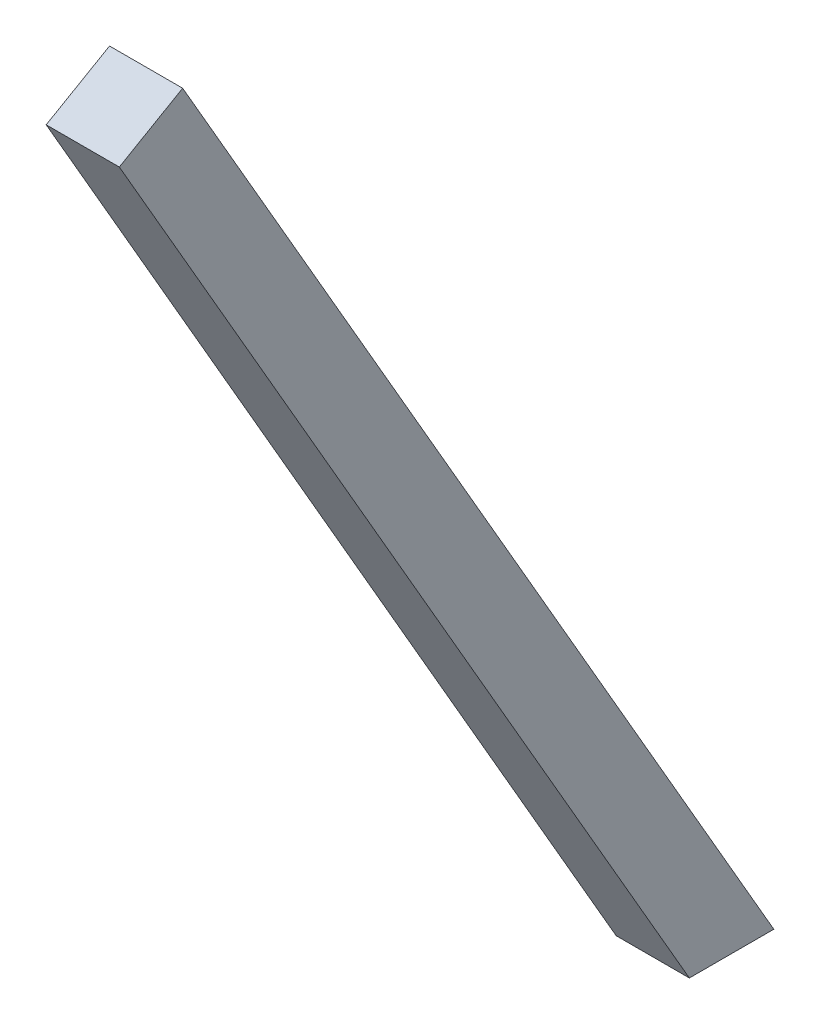
ISO-10303-21;
HEADER;
FILE_DESCRIPTION(('STEP AP214'),'2;1');
FILE_NAME('part.step','',(''),(''),'','','');
FILE_SCHEMA(('AUTOMOTIVE_DESIGN { 1 0 10303 214 1 1 1 1 }'));
ENDSEC;
DATA;
#1=APPLICATION_CONTEXT('core data for automotive mechanical design processes');
#2=APPLICATION_PROTOCOL_DEFINITION('international standard','automotive_design',2000,#1);
#3=PRODUCT_CONTEXT('',#1,'mechanical');
#4=PRODUCT('Part','Part','',(#3));
#5=PRODUCT_RELATED_PRODUCT_CATEGORY('part','',(#4));
#6=PRODUCT_DEFINITION_FORMATION('','',#4);
#7=PRODUCT_DEFINITION_CONTEXT('part definition',#1,'design');
#8=PRODUCT_DEFINITION('design','',#6,#7);
#9=PRODUCT_DEFINITION_SHAPE('','',#8);
#10=(LENGTH_UNIT() NAMED_UNIT(*) SI_UNIT(.MILLI.,.METRE.));
#11=(NAMED_UNIT(*) PLANE_ANGLE_UNIT() SI_UNIT($,.RADIAN.));
#12=(NAMED_UNIT(*) SI_UNIT($,.STERADIAN.) SOLID_ANGLE_UNIT());
#13=UNCERTAINTY_MEASURE_WITH_UNIT(LENGTH_MEASURE(1.E-05),#10,'distance_accuracy_value','');
#14=(GEOMETRIC_REPRESENTATION_CONTEXT(3) GLOBAL_UNCERTAINTY_ASSIGNED_CONTEXT((#13)) GLOBAL_UNIT_ASSIGNED_CONTEXT((#10,
#11,#12)) REPRESENTATION_CONTEXT('',''));
#15=CARTESIAN_POINT('',(0.,0.,0.));
#16=DIRECTION('',(0.,0.,1.));
#17=DIRECTION('',(1.,0.,0.));
#18=AXIS2_PLACEMENT_3D('',#15,#16,#17);
#19=CARTESIAN_POINT('',(25.4,0.,-29.329393674833));
#20=DIRECTION('',(0.,1.,0.));
#21=DIRECTION('',(0.,0.,1.));
#22=AXIS2_PLACEMENT_3D('',#19,#20,#21);
#23=PLANE('',#22);
#24=DIRECTION('',(0.,0.,-1.));
#25=VECTOR('',#24,1.);
#26=CARTESIAN_POINT('',(0.,0.,-29.329393674833));
#27=LINE('',#26,#25);
#28=CARTESIAN_POINT('',(0.,0.,0.));
#29=VERTEX_POINT('',#28);
#30=CARTESIAN_POINT('',(0.,0.,-29.329393674833));
#31=VERTEX_POINT('',#30);
#32=EDGE_CURVE('E96',#29,#31,#27,.T.);
#33=ORIENTED_EDGE('',*,*,#32,.T.);
#34=DIRECTION('',(-1.,0.,0.));
#35=VECTOR('',#34,1.);
#36=CARTESIAN_POINT('',(25.4,0.,-29.329393674833));
#37=LINE('',#36,#35);
#38=CARTESIAN_POINT('',(25.4,0.,-29.329393674833));
#39=VERTEX_POINT('',#38);
#40=EDGE_CURVE('E11',#39,#31,#37,.T.);
#41=ORIENTED_EDGE('',*,*,#40,.F.);
#42=DIRECTION('',(0.,0.,-1.));
#43=VECTOR('',#42,1.);
#44=CARTESIAN_POINT('',(25.4,0.,-29.329393674833));
#45=LINE('',#44,#43);
#46=CARTESIAN_POINT('',(25.4,0.,0.));
#47=VERTEX_POINT('',#46);
#48=EDGE_CURVE('E84',#47,#39,#45,.T.);
#49=ORIENTED_EDGE('',*,*,#48,.F.);
#50=DIRECTION('',(-1.,0.,0.));
#51=VECTOR('',#50,1.);
#52=CARTESIAN_POINT('',(25.4,0.,0.));
#53=LINE('',#52,#51);
#54=EDGE_CURVE('E92',#47,#29,#53,.T.);
#55=ORIENTED_EDGE('',*,*,#54,.T.);
#56=EDGE_LOOP('',(#33,#41,#49,#55));
#57=FACE_BOUND('',#56,.T.);
#58=ADVANCED_FACE('F33',(#57),#23,.F.);
#59=CARTESIAN_POINT('',(25.4,355.6,175.976362048997));
#60=DIRECTION('',(0.,-0.499999999999998,0.86602540378444));
#61=DIRECTION('',(0.,-0.86602540378444,-0.499999999999998));
#62=AXIS2_PLACEMENT_3D('',#59,#60,#61);
#63=PLANE('',#62);
#64=DIRECTION('',(0.,0.86602540378444,0.499999999999998));
#65=VECTOR('',#64,1.);
#66=CARTESIAN_POINT('',(0.,355.6,175.976362048997));
#67=LINE('',#66,#65);
#68=CARTESIAN_POINT('',(0.,355.6,175.976362048997));
#69=VERTEX_POINT('',#68);
#70=EDGE_CURVE('E88',#31,#69,#67,.T.);
#71=ORIENTED_EDGE('',*,*,#70,.T.);
#72=DIRECTION('',(-1.,0.,0.));
#73=VECTOR('',#72,1.);
#74=CARTESIAN_POINT('',(25.4,355.6,175.976362048997));
#75=LINE('',#74,#73);
#76=CARTESIAN_POINT('',(25.4,355.6,175.976362048997));
#77=VERTEX_POINT('',#76);
#78=EDGE_CURVE('E41',#77,#69,#75,.T.);
#79=ORIENTED_EDGE('',*,*,#78,.F.);
#80=DIRECTION('',(0.,0.86602540378444,0.499999999999998));
#81=VECTOR('',#80,1.);
#82=CARTESIAN_POINT('',(25.4,355.6,175.976362048997));
#83=LINE('',#82,#81);
#84=EDGE_CURVE('E79',#39,#77,#83,.T.);
#85=ORIENTED_EDGE('',*,*,#84,.F.);
#86=ORIENTED_EDGE('',*,*,#40,.T.);
#87=EDGE_LOOP('',(#71,#79,#85,#86));
#88=FACE_BOUND('',#87,.T.);
#89=ADVANCED_FACE('F87',(#88),#63,.F.);
#90=CARTESIAN_POINT('',(25.4,342.9,197.973407305121));
#91=DIRECTION('',(0.,-0.86602540378444,-0.499999999999997));
#92=DIRECTION('',(0.,0.499999999999997,-0.866025403784441));
#93=AXIS2_PLACEMENT_3D('',#90,#91,#92);
#94=PLANE('',#93);
#95=DIRECTION('',(0.,-0.499999999999997,0.86602540378444));
#96=VECTOR('',#95,1.);
#97=CARTESIAN_POINT('',(0.,342.9,197.973407305121));
#98=LINE('',#97,#96);
#99=CARTESIAN_POINT('',(0.,342.9,197.973407305121));
#100=VERTEX_POINT('',#99);
#101=EDGE_CURVE('E66',#69,#100,#98,.T.);
#102=ORIENTED_EDGE('',*,*,#101,.T.);
#103=DIRECTION('',(-1.,0.,0.));
#104=VECTOR('',#103,1.);
#105=CARTESIAN_POINT('',(25.4,342.9,197.973407305121));
#106=LINE('',#105,#104);
#107=CARTESIAN_POINT('',(25.4,342.9,197.973407305121));
#108=VERTEX_POINT('',#107);
#109=EDGE_CURVE('E89',#108,#100,#106,.T.);
#110=ORIENTED_EDGE('',*,*,#109,.F.);
#111=DIRECTION('',(0.,-0.499999999999997,0.86602540378444));
#112=VECTOR('',#111,1.);
#113=CARTESIAN_POINT('',(25.4,342.9,197.973407305121));
#114=LINE('',#113,#112);
#115=EDGE_CURVE('E82',#77,#108,#114,.T.);
#116=ORIENTED_EDGE('',*,*,#115,.F.);
#117=ORIENTED_EDGE('',*,*,#78,.T.);
#118=EDGE_LOOP('',(#102,#110,#116,#117));
#119=FACE_BOUND('',#118,.T.);
#120=ADVANCED_FACE('F90',(#119),#94,.F.);
#121=CARTESIAN_POINT('',(25.4,0.,0.));
#122=DIRECTION('',(0.,0.499999999999998,-0.86602540378444));
#123=DIRECTION('',(0.,0.86602540378444,0.499999999999998));
#124=AXIS2_PLACEMENT_3D('',#121,#122,#123);
#125=PLANE('',#124);
#126=DIRECTION('',(0.,-0.86602540378444,-0.499999999999998));
#127=VECTOR('',#126,1.);
#128=CARTESIAN_POINT('',(0.,0.,0.));
#129=LINE('',#128,#127);
#130=EDGE_CURVE('E72',#100,#29,#129,.T.);
#131=ORIENTED_EDGE('',*,*,#130,.T.);
#132=ORIENTED_EDGE('',*,*,#54,.F.);
#133=DIRECTION('',(0.,-0.86602540378444,-0.499999999999998));
#134=VECTOR('',#133,1.);
#135=CARTESIAN_POINT('',(25.4,0.,0.));
#136=LINE('',#135,#134);
#137=EDGE_CURVE('E49',#108,#47,#136,.T.);
#138=ORIENTED_EDGE('',*,*,#137,.F.);
#139=ORIENTED_EDGE('',*,*,#109,.T.);
#140=EDGE_LOOP('',(#131,#132,#138,#139));
#141=FACE_BOUND('',#140,.T.);
#142=ADVANCED_FACE('F103',(#141),#125,.F.);
#143=CARTESIAN_POINT('',(25.4,0.,0.));
#144=DIRECTION('',(-1.,0.,0.));
#145=DIRECTION('',(0.,0.,1.));
#146=AXIS2_PLACEMENT_3D('',#143,#144,#145);
#147=PLANE('',#146);
#148=ORIENTED_EDGE('',*,*,#48,.T.);
#149=ORIENTED_EDGE('',*,*,#84,.T.);
#150=ORIENTED_EDGE('',*,*,#115,.T.);
#151=ORIENTED_EDGE('',*,*,#137,.T.);
#152=EDGE_LOOP('',(#148,#149,#150,#151));
#153=FACE_BOUND('',#152,.T.);
#154=ADVANCED_FACE('F80',(#153),#147,.F.);
#155=CARTESIAN_POINT('',(0.,0.,0.));
#156=DIRECTION('',(-1.,0.,0.));
#157=DIRECTION('',(0.,0.,1.));
#158=AXIS2_PLACEMENT_3D('',#155,#156,#157);
#159=PLANE('',#158);
#160=ORIENTED_EDGE('',*,*,#32,.F.);
#161=ORIENTED_EDGE('',*,*,#130,.F.);
#162=ORIENTED_EDGE('',*,*,#101,.F.);
#163=ORIENTED_EDGE('',*,*,#70,.F.);
#164=EDGE_LOOP('',(#160,#161,#162,#163));
#165=FACE_BOUND('',#164,.T.);
#166=ADVANCED_FACE('F106',(#165),#159,.T.);
#167=CLOSED_SHELL('',(#58,#89,#120,#142,#154,#166));
#168=MANIFOLD_SOLID_BREP('B2',#167);
#169=ADVANCED_BREP_SHAPE_REPRESENTATION('',(#18,#168),#14);
#170=SHAPE_DEFINITION_REPRESENTATION(#9,#169);
ENDSEC;
END-ISO-10303-21;
